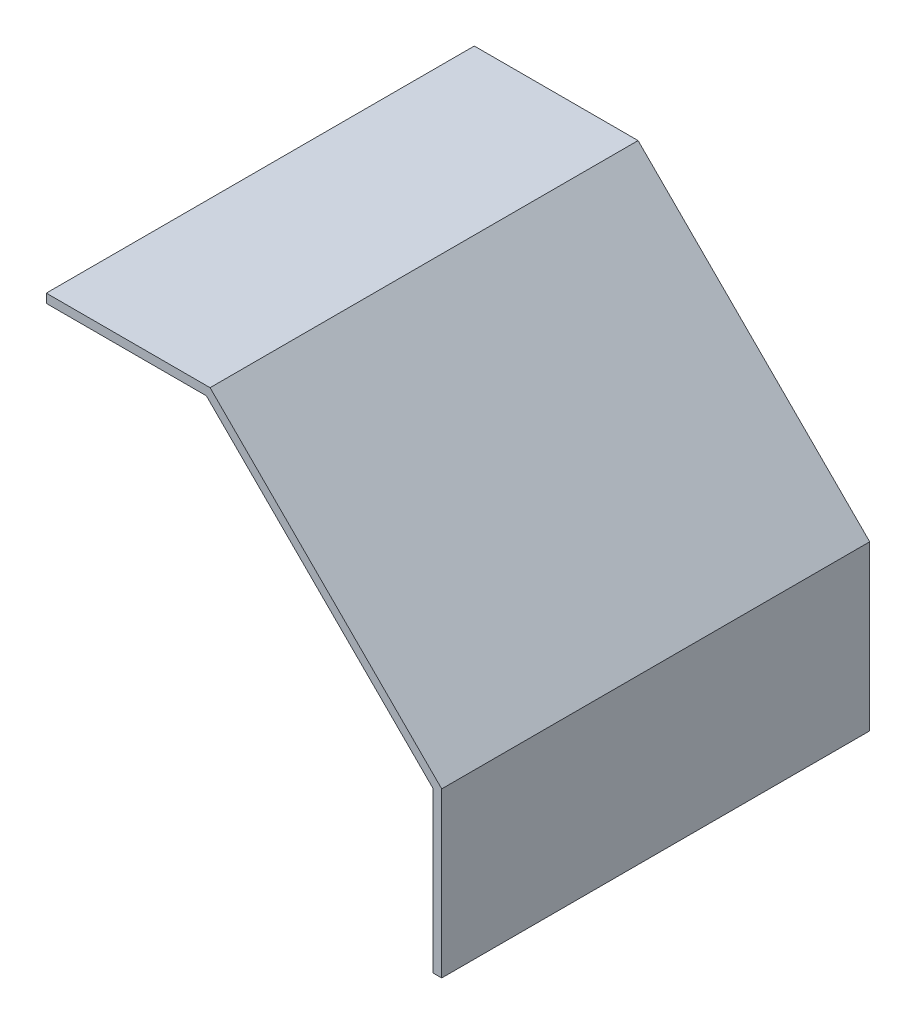
ISO-10303-21;
HEADER;
FILE_DESCRIPTION(('STEP AP214'),'2;1');
FILE_NAME('part.step','',(''),(''),'','','');
FILE_SCHEMA(('AUTOMOTIVE_DESIGN { 1 0 10303 214 1 1 1 1 }'));
ENDSEC;
DATA;
#1=APPLICATION_CONTEXT('core data for automotive mechanical design processes');
#2=APPLICATION_PROTOCOL_DEFINITION('international standard','automotive_design',2000,#1);
#3=PRODUCT_CONTEXT('',#1,'mechanical');
#4=PRODUCT('Part','Part','',(#3));
#5=PRODUCT_RELATED_PRODUCT_CATEGORY('part','',(#4));
#6=PRODUCT_DEFINITION_FORMATION('','',#4);
#7=PRODUCT_DEFINITION_CONTEXT('part definition',#1,'design');
#8=PRODUCT_DEFINITION('design','',#6,#7);
#9=PRODUCT_DEFINITION_SHAPE('','',#8);
#10=(LENGTH_UNIT() NAMED_UNIT(*) SI_UNIT(.MILLI.,.METRE.));
#11=(NAMED_UNIT(*) PLANE_ANGLE_UNIT() SI_UNIT($,.RADIAN.));
#12=(NAMED_UNIT(*) SI_UNIT($,.STERADIAN.) SOLID_ANGLE_UNIT());
#13=UNCERTAINTY_MEASURE_WITH_UNIT(LENGTH_MEASURE(1.E-05),#10,'distance_accuracy_value','');
#14=(GEOMETRIC_REPRESENTATION_CONTEXT(3) GLOBAL_UNCERTAINTY_ASSIGNED_CONTEXT((#13)) GLOBAL_UNIT_ASSIGNED_CONTEXT((#10,
#11,#12)) REPRESENTATION_CONTEXT('',''));
#15=CARTESIAN_POINT('',(0.,0.,0.));
#16=DIRECTION('',(0.,0.,1.));
#17=DIRECTION('',(1.,0.,0.));
#18=AXIS2_PLACEMENT_3D('',#15,#16,#17);
#19=CARTESIAN_POINT('',(0.,281.59848150944,304.8));
#20=DIRECTION('',(1.,0.,0.));
#21=DIRECTION('',(0.,1.,0.));
#22=AXIS2_PLACEMENT_3D('',#19,#20,#21);
#23=PLANE('',#22);
#24=DIRECTION('',(0.,-1.,0.));
#25=VECTOR('',#24,1.);
#26=CARTESIAN_POINT('',(0.,281.59848150944,0.));
#27=LINE('',#26,#25);
#28=CARTESIAN_POINT('',(0.,281.59848150944,0.));
#29=VERTEX_POINT('',#28);
#30=CARTESIAN_POINT('',(0.,275.24848150944,0.));
#31=VERTEX_POINT('',#30);
#32=EDGE_CURVE('E132',#29,#31,#27,.T.);
#33=ORIENTED_EDGE('',*,*,#32,.T.);
#34=DIRECTION('',(0.,0.,-1.));
#35=VECTOR('',#34,1.);
#36=CARTESIAN_POINT('',(0.,275.24848150944,304.8));
#37=LINE('',#36,#35);
#38=CARTESIAN_POINT('',(0.,275.24848150944,304.8));
#39=VERTEX_POINT('',#38);
#40=EDGE_CURVE('E11',#39,#31,#37,.T.);
#41=ORIENTED_EDGE('',*,*,#40,.F.);
#42=DIRECTION('',(0.,-1.,0.));
#43=VECTOR('',#42,1.);
#44=CARTESIAN_POINT('',(0.,281.59848150944,304.8));
#45=LINE('',#44,#43);
#46=CARTESIAN_POINT('',(0.,281.59848150944,304.8));
#47=VERTEX_POINT('',#46);
#48=EDGE_CURVE('E146',#47,#39,#45,.T.);
#49=ORIENTED_EDGE('',*,*,#48,.F.);
#50=DIRECTION('',(0.,0.,-1.));
#51=VECTOR('',#50,1.);
#52=CARTESIAN_POINT('',(0.,281.59848150944,304.8));
#53=LINE('',#52,#51);
#54=EDGE_CURVE('E128',#47,#29,#53,.T.);
#55=ORIENTED_EDGE('',*,*,#54,.T.);
#56=EDGE_LOOP('',(#33,#41,#49,#55));
#57=FACE_BOUND('',#56,.T.);
#58=ADVANCED_FACE('F36',(#57),#23,.F.);
#59=CARTESIAN_POINT('',(0.,275.24848150944,304.8));
#60=DIRECTION('',(0.,1.,0.));
#61=DIRECTION('',(0.,0.,1.));
#62=AXIS2_PLACEMENT_3D('',#59,#60,#61);
#63=PLANE('',#62);
#64=DIRECTION('',(1.,0.,0.));
#65=VECTOR('',#64,1.);
#66=CARTESIAN_POINT('',(0.,275.24848150944,0.));
#67=LINE('',#66,#65);
#68=CARTESIAN_POINT('',(114.01165406381,275.24848150944,0.));
#69=VERTEX_POINT('',#68);
#70=EDGE_CURVE('E135',#31,#69,#67,.T.);
#71=ORIENTED_EDGE('',*,*,#70,.T.);
#72=DIRECTION('',(0.,0.,-1.));
#73=VECTOR('',#72,1.);
#74=CARTESIAN_POINT('',(114.01165406381,275.24848150944,304.8));
#75=LINE('',#74,#73);
#76=CARTESIAN_POINT('',(114.01165406381,275.24848150944,304.8));
#77=VERTEX_POINT('',#76);
#78=EDGE_CURVE('E44',#77,#69,#75,.T.);
#79=ORIENTED_EDGE('',*,*,#78,.F.);
#80=DIRECTION('',(1.,0.,0.));
#81=VECTOR('',#80,1.);
#82=CARTESIAN_POINT('',(0.,275.24848150944,304.8));
#83=LINE('',#82,#81);
#84=EDGE_CURVE('E95',#39,#77,#83,.T.);
#85=ORIENTED_EDGE('',*,*,#84,.F.);
#86=ORIENTED_EDGE('',*,*,#40,.T.);
#87=EDGE_LOOP('',(#71,#79,#85,#86));
#88=FACE_BOUND('',#87,.T.);
#89=ADVANCED_FACE('F181',(#88),#63,.F.);
#90=CARTESIAN_POINT('',(114.01165406381,275.24848150944,304.8));
#91=DIRECTION('',(0.707106781186548,0.707106781186547,0.));
#92=DIRECTION('',(-0.707106781186547,0.707106781186548,0.));
#93=AXIS2_PLACEMENT_3D('',#90,#91,#92);
#94=PLANE('',#93);
#95=DIRECTION('',(0.707106781186547,-0.707106781186548,0.));
#96=VECTOR('',#95,1.);
#97=CARTESIAN_POINT('',(114.01165406381,275.24848150944,0.));
#98=LINE('',#97,#96);
#99=CARTESIAN_POINT('',(275.24848150944,114.01165406381,0.));
#100=VERTEX_POINT('',#99);
#101=EDGE_CURVE('E137',#69,#100,#98,.T.);
#102=ORIENTED_EDGE('',*,*,#101,.T.);
#103=DIRECTION('',(0.,0.,-1.));
#104=VECTOR('',#103,1.);
#105=CARTESIAN_POINT('',(275.24848150944,114.01165406381,304.8));
#106=LINE('',#105,#104);
#107=CARTESIAN_POINT('',(275.24848150944,114.01165406381,304.8));
#108=VERTEX_POINT('',#107);
#109=EDGE_CURVE('E153',#108,#100,#106,.T.);
#110=ORIENTED_EDGE('',*,*,#109,.F.);
#111=DIRECTION('',(0.707106781186547,-0.707106781186548,0.));
#112=VECTOR('',#111,1.);
#113=CARTESIAN_POINT('',(114.01165406381,275.24848150944,304.8));
#114=LINE('',#113,#112);
#115=EDGE_CURVE('E161',#77,#108,#114,.T.);
#116=ORIENTED_EDGE('',*,*,#115,.F.);
#117=ORIENTED_EDGE('',*,*,#78,.T.);
#118=EDGE_LOOP('',(#102,#110,#116,#117));
#119=FACE_BOUND('',#118,.T.);
#120=ADVANCED_FACE('F159',(#119),#94,.F.);
#121=CARTESIAN_POINT('',(275.24848150944,114.01165406381,304.8));
#122=DIRECTION('',(1.,0.,0.));
#123=DIRECTION('',(0.,0.,-1.));
#124=AXIS2_PLACEMENT_3D('',#121,#122,#123);
#125=PLANE('',#124);
#126=DIRECTION('',(0.,-1.,0.));
#127=VECTOR('',#126,1.);
#128=CARTESIAN_POINT('',(275.24848150944,114.01165406381,0.));
#129=LINE('',#128,#127);
#130=CARTESIAN_POINT('',(275.24848150944,0.,0.));
#131=VERTEX_POINT('',#130);
#132=EDGE_CURVE('E139',#100,#131,#129,.T.);
#133=ORIENTED_EDGE('',*,*,#132,.T.);
#134=DIRECTION('',(0.,0.,-1.));
#135=VECTOR('',#134,1.);
#136=CARTESIAN_POINT('',(275.24848150944,0.,304.8));
#137=LINE('',#136,#135);
#138=CARTESIAN_POINT('',(275.24848150944,0.,304.8));
#139=VERTEX_POINT('',#138);
#140=EDGE_CURVE('E150',#139,#131,#137,.T.);
#141=ORIENTED_EDGE('',*,*,#140,.F.);
#142=DIRECTION('',(0.,-1.,0.));
#143=VECTOR('',#142,1.);
#144=CARTESIAN_POINT('',(275.24848150944,114.01165406381,304.8));
#145=LINE('',#144,#143);
#146=EDGE_CURVE('E173',#108,#139,#145,.T.);
#147=ORIENTED_EDGE('',*,*,#146,.F.);
#148=ORIENTED_EDGE('',*,*,#109,.T.);
#149=EDGE_LOOP('',(#133,#141,#147,#148));
#150=FACE_BOUND('',#149,.T.);
#151=ADVANCED_FACE('F169',(#150),#125,.F.);
#152=CARTESIAN_POINT('',(275.24848150944,0.,304.8));
#153=DIRECTION('',(0.,1.,0.));
#154=DIRECTION('',(-1.,0.,0.));
#155=AXIS2_PLACEMENT_3D('',#152,#153,#154);
#156=PLANE('',#155);
#157=DIRECTION('',(1.,0.,0.));
#158=VECTOR('',#157,1.);
#159=CARTESIAN_POINT('',(275.24848150944,0.,0.));
#160=LINE('',#159,#158);
#161=CARTESIAN_POINT('',(281.59848150944,0.,0.));
#162=VERTEX_POINT('',#161);
#163=EDGE_CURVE('E141',#131,#162,#160,.T.);
#164=ORIENTED_EDGE('',*,*,#163,.T.);
#165=DIRECTION('',(0.,0.,-1.));
#166=VECTOR('',#165,1.);
#167=CARTESIAN_POINT('',(281.59848150944,0.,304.8));
#168=LINE('',#167,#166);
#169=CARTESIAN_POINT('',(281.59848150944,0.,304.8));
#170=VERTEX_POINT('',#169);
#171=EDGE_CURVE('E123',#170,#162,#168,.T.);
#172=ORIENTED_EDGE('',*,*,#171,.F.);
#173=DIRECTION('',(1.,0.,0.));
#174=VECTOR('',#173,1.);
#175=CARTESIAN_POINT('',(275.24848150944,0.,304.8));
#176=LINE('',#175,#174);
#177=EDGE_CURVE('E114',#139,#170,#176,.T.);
#178=ORIENTED_EDGE('',*,*,#177,.F.);
#179=ORIENTED_EDGE('',*,*,#140,.T.);
#180=EDGE_LOOP('',(#164,#172,#178,#179));
#181=FACE_BOUND('',#180,.T.);
#182=ADVANCED_FACE('F172',(#181),#156,.F.);
#183=CARTESIAN_POINT('',(281.59848150944,116.641910184879,304.8));
#184=DIRECTION('',(-1.,0.,0.));
#185=DIRECTION('',(0.,-1.,0.));
#186=AXIS2_PLACEMENT_3D('',#183,#184,#185);
#187=PLANE('',#186);
#188=DIRECTION('',(0.,1.,0.));
#189=VECTOR('',#188,1.);
#190=CARTESIAN_POINT('',(281.59848150944,116.641910184879,0.));
#191=LINE('',#190,#189);
#192=CARTESIAN_POINT('',(281.59848150944,116.641910184879,0.));
#193=VERTEX_POINT('',#192);
#194=EDGE_CURVE('E122',#162,#193,#191,.T.);
#195=ORIENTED_EDGE('',*,*,#194,.T.);
#196=DIRECTION('',(0.,0.,-1.));
#197=VECTOR('',#196,1.);
#198=CARTESIAN_POINT('',(281.59848150944,116.641910184879,304.8));
#199=LINE('',#198,#197);
#200=CARTESIAN_POINT('',(281.59848150944,116.641910184879,304.8));
#201=VERTEX_POINT('',#200);
#202=EDGE_CURVE('E119',#201,#193,#199,.T.);
#203=ORIENTED_EDGE('',*,*,#202,.F.);
#204=DIRECTION('',(0.,1.,0.));
#205=VECTOR('',#204,1.);
#206=CARTESIAN_POINT('',(281.59848150944,116.641910184879,304.8));
#207=LINE('',#206,#205);
#208=EDGE_CURVE('E108',#170,#201,#207,.T.);
#209=ORIENTED_EDGE('',*,*,#208,.F.);
#210=ORIENTED_EDGE('',*,*,#171,.T.);
#211=EDGE_LOOP('',(#195,#203,#209,#210));
#212=FACE_BOUND('',#211,.T.);
#213=ADVANCED_FACE('F120',(#212),#187,.F.);
#214=CARTESIAN_POINT('',(116.641910184879,281.59848150944,304.8));
#215=DIRECTION('',(-0.707106781186548,-0.707106781186547,0.));
#216=DIRECTION('',(0.707106781186547,-0.707106781186548,0.));
#217=AXIS2_PLACEMENT_3D('',#214,#215,#216);
#218=PLANE('',#217);
#219=DIRECTION('',(-0.707106781186547,0.707106781186548,0.));
#220=VECTOR('',#219,1.);
#221=CARTESIAN_POINT('',(116.641910184879,281.59848150944,0.));
#222=LINE('',#221,#220);
#223=CARTESIAN_POINT('',(116.641910184879,281.59848150944,0.));
#224=VERTEX_POINT('',#223);
#225=EDGE_CURVE('E81',#193,#224,#222,.T.);
#226=ORIENTED_EDGE('',*,*,#225,.T.);
#227=DIRECTION('',(0.,0.,-1.));
#228=VECTOR('',#227,1.);
#229=CARTESIAN_POINT('',(116.641910184879,281.59848150944,304.8));
#230=LINE('',#229,#228);
#231=CARTESIAN_POINT('',(116.641910184879,281.59848150944,304.8));
#232=VERTEX_POINT('',#231);
#233=EDGE_CURVE('E124',#232,#224,#230,.T.);
#234=ORIENTED_EDGE('',*,*,#233,.F.);
#235=DIRECTION('',(-0.707106781186547,0.707106781186548,0.));
#236=VECTOR('',#235,1.);
#237=CARTESIAN_POINT('',(116.641910184879,281.59848150944,304.8));
#238=LINE('',#237,#236);
#239=EDGE_CURVE('E112',#201,#232,#238,.T.);
#240=ORIENTED_EDGE('',*,*,#239,.F.);
#241=ORIENTED_EDGE('',*,*,#202,.T.);
#242=EDGE_LOOP('',(#226,#234,#240,#241));
#243=FACE_BOUND('',#242,.T.);
#244=ADVANCED_FACE('F126',(#243),#218,.F.);
#245=CARTESIAN_POINT('',(0.,281.59848150944,304.8));
#246=DIRECTION('',(0.,-1.,0.));
#247=DIRECTION('',(1.,0.,0.));
#248=AXIS2_PLACEMENT_3D('',#245,#246,#247);
#249=PLANE('',#248);
#250=DIRECTION('',(-1.,0.,0.));
#251=VECTOR('',#250,1.);
#252=CARTESIAN_POINT('',(0.,281.59848150944,0.));
#253=LINE('',#252,#251);
#254=EDGE_CURVE('E87',#224,#29,#253,.T.);
#255=ORIENTED_EDGE('',*,*,#254,.T.);
#256=ORIENTED_EDGE('',*,*,#54,.F.);
#257=DIRECTION('',(-1.,0.,0.));
#258=VECTOR('',#257,1.);
#259=CARTESIAN_POINT('',(0.,281.59848150944,304.8));
#260=LINE('',#259,#258);
#261=EDGE_CURVE('E52',#232,#47,#260,.T.);
#262=ORIENTED_EDGE('',*,*,#261,.F.);
#263=ORIENTED_EDGE('',*,*,#233,.T.);
#264=EDGE_LOOP('',(#255,#256,#262,#263));
#265=FACE_BOUND('',#264,.T.);
#266=ADVANCED_FACE('F197',(#265),#249,.F.);
#267=CARTESIAN_POINT('',(0.,0.,304.8));
#268=DIRECTION('',(0.,0.,1.));
#269=DIRECTION('',(1.,0.,0.));
#270=AXIS2_PLACEMENT_3D('',#267,#268,#269);
#271=PLANE('',#270);
#272=ORIENTED_EDGE('',*,*,#48,.T.);
#273=ORIENTED_EDGE('',*,*,#84,.T.);
#274=ORIENTED_EDGE('',*,*,#115,.T.);
#275=ORIENTED_EDGE('',*,*,#146,.T.);
#276=ORIENTED_EDGE('',*,*,#177,.T.);
#277=ORIENTED_EDGE('',*,*,#208,.T.);
#278=ORIENTED_EDGE('',*,*,#239,.T.);
#279=ORIENTED_EDGE('',*,*,#261,.T.);
#280=EDGE_LOOP('',(#272,#273,#274,#275,#276,#277,#278,#279));
#281=FACE_BOUND('',#280,.T.);
#282=ADVANCED_FACE('F110',(#281),#271,.T.);
#283=CARTESIAN_POINT('',(0.,0.,0.));
#284=DIRECTION('',(0.,0.,1.));
#285=DIRECTION('',(1.,0.,0.));
#286=AXIS2_PLACEMENT_3D('',#283,#284,#285);
#287=PLANE('',#286);
#288=ORIENTED_EDGE('',*,*,#32,.F.);
#289=ORIENTED_EDGE('',*,*,#254,.F.);
#290=ORIENTED_EDGE('',*,*,#225,.F.);
#291=ORIENTED_EDGE('',*,*,#194,.F.);
#292=ORIENTED_EDGE('',*,*,#163,.F.);
#293=ORIENTED_EDGE('',*,*,#132,.F.);
#294=ORIENTED_EDGE('',*,*,#101,.F.);
#295=ORIENTED_EDGE('',*,*,#70,.F.);
#296=EDGE_LOOP('',(#288,#289,#290,#291,#292,#293,#294,#295));
#297=FACE_BOUND('',#296,.T.);
#298=ADVANCED_FACE('F165',(#297),#287,.F.);
#299=CLOSED_SHELL('',(#58,#89,#120,#151,#182,#213,#244,#266,#282,#298));
#300=MANIFOLD_SOLID_BREP('B2',#299);
#301=ADVANCED_BREP_SHAPE_REPRESENTATION('',(#18,#300),#14);
#302=SHAPE_DEFINITION_REPRESENTATION(#9,#301);
ENDSEC;
END-ISO-10303-21;
